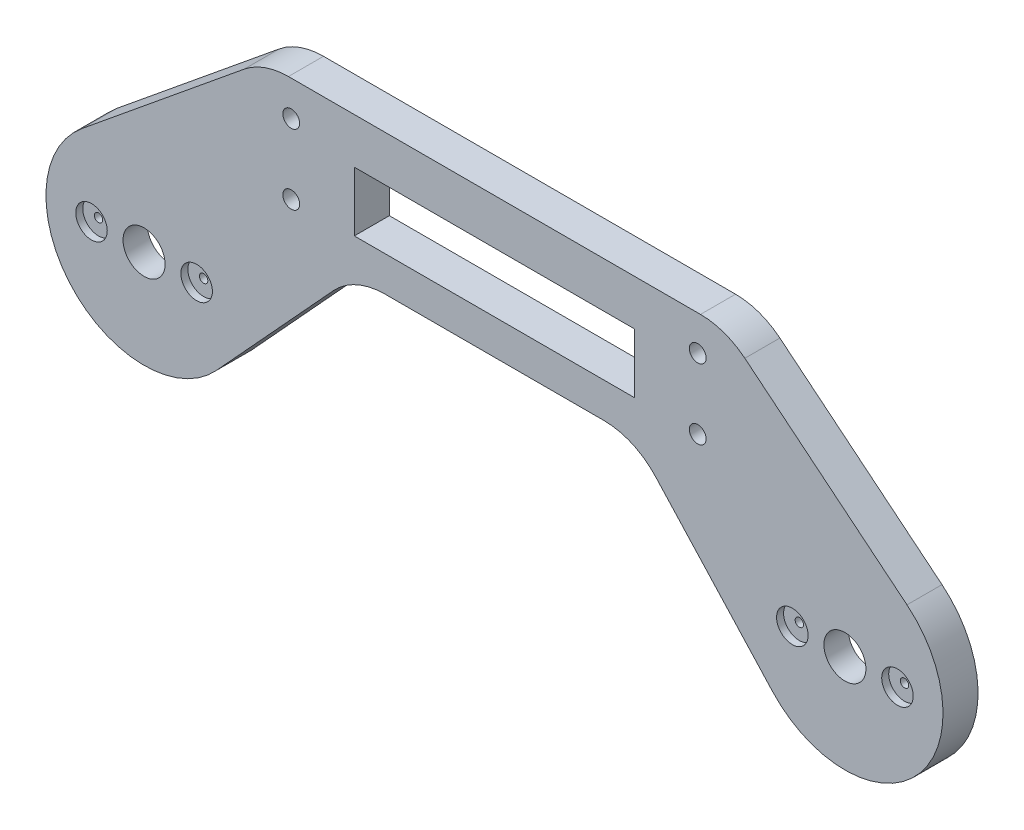
ISO-10303-21;
HEADER;
FILE_DESCRIPTION(('STEP AP214'),'2;1');
FILE_NAME('part.step','',(''),(''),'','','');
FILE_SCHEMA(('AUTOMOTIVE_DESIGN { 1 0 10303 214 1 1 1 1 }'));
ENDSEC;
DATA;
#1=APPLICATION_CONTEXT('core data for automotive mechanical design processes');
#2=APPLICATION_PROTOCOL_DEFINITION('international standard','automotive_design',2000,#1);
#3=PRODUCT_CONTEXT('',#1,'mechanical');
#4=PRODUCT('Part','Part','',(#3));
#5=PRODUCT_RELATED_PRODUCT_CATEGORY('part','',(#4));
#6=PRODUCT_DEFINITION_FORMATION('','',#4);
#7=PRODUCT_DEFINITION_CONTEXT('part definition',#1,'design');
#8=PRODUCT_DEFINITION('design','',#6,#7);
#9=PRODUCT_DEFINITION_SHAPE('','',#8);
#10=(LENGTH_UNIT() NAMED_UNIT(*) SI_UNIT(.MILLI.,.METRE.));
#11=(NAMED_UNIT(*) PLANE_ANGLE_UNIT() SI_UNIT($,.RADIAN.));
#12=(NAMED_UNIT(*) SI_UNIT($,.STERADIAN.) SOLID_ANGLE_UNIT());
#13=UNCERTAINTY_MEASURE_WITH_UNIT(LENGTH_MEASURE(1.E-05),#10,'distance_accuracy_value','');
#14=(GEOMETRIC_REPRESENTATION_CONTEXT(3) GLOBAL_UNCERTAINTY_ASSIGNED_CONTEXT((#13)) GLOBAL_UNIT_ASSIGNED_CONTEXT((#10,
#11,#12)) REPRESENTATION_CONTEXT('',''));
#15=CARTESIAN_POINT('',(0.,0.,0.));
#16=DIRECTION('',(0.,0.,1.));
#17=DIRECTION('',(1.,0.,0.));
#18=AXIS2_PLACEMENT_3D('',#15,#16,#17);
#19=CARTESIAN_POINT('',(42.5,-22.,6.5));
#20=DIRECTION('',(0.,0.,-1.));
#21=DIRECTION('',(-1.,0.,0.));
#22=AXIS2_PLACEMENT_3D('',#19,#20,#21);
#23=CYLINDRICAL_SURFACE('',#22,0.6);
#24=CARTESIAN_POINT('',(42.5,-22.,1.5));
#25=DIRECTION('',(0.,0.,-1.));
#26=DIRECTION('',(-1.,0.,0.));
#27=AXIS2_PLACEMENT_3D('',#24,#25,#26);
#28=CIRCLE('',#27,0.6);
#29=CARTESIAN_POINT('',(41.9,-22.,1.5));
#30=VERTEX_POINT('',#29);
#31=EDGE_CURVE('E347',#30,#30,#28,.T.);
#32=ORIENTED_EDGE('',*,*,#31,.T.);
#33=EDGE_LOOP('',(#32));
#34=FACE_BOUND('',#33,.T.);
#35=CARTESIAN_POINT('',(42.5,-22.,4.));
#36=DIRECTION('',(0.,0.,1.));
#37=DIRECTION('',(1.,0.,0.));
#38=AXIS2_PLACEMENT_3D('',#35,#36,#37);
#39=CIRCLE('',#38,0.6);
#40=CARTESIAN_POINT('',(43.1,-22.,4.));
#41=VERTEX_POINT('',#40);
#42=EDGE_CURVE('E40',#41,#41,#39,.F.);
#43=ORIENTED_EDGE('',*,*,#42,.F.);
#44=EDGE_LOOP('',(#43));
#45=FACE_BOUND('',#44,.T.);
#46=ADVANCED_FACE('F36',(#34,#45),#23,.F.);
#47=CARTESIAN_POINT('',(57.5,-22.,6.5));
#48=DIRECTION('',(0.,0.,-1.));
#49=DIRECTION('',(-1.,0.,0.));
#50=AXIS2_PLACEMENT_3D('',#47,#48,#49);
#51=CYLINDRICAL_SURFACE('',#50,0.6);
#52=CARTESIAN_POINT('',(57.5,-22.,1.5));
#53=DIRECTION('',(0.,0.,-1.));
#54=DIRECTION('',(-1.,0.,0.));
#55=AXIS2_PLACEMENT_3D('',#52,#53,#54);
#56=CIRCLE('',#55,0.6);
#57=CARTESIAN_POINT('',(56.9,-22.,1.5));
#58=VERTEX_POINT('',#57);
#59=EDGE_CURVE('E344',#58,#58,#56,.T.);
#60=ORIENTED_EDGE('',*,*,#59,.T.);
#61=EDGE_LOOP('',(#60));
#62=FACE_BOUND('',#61,.T.);
#63=CARTESIAN_POINT('',(57.5,-22.,4.));
#64=DIRECTION('',(0.,0.,1.));
#65=DIRECTION('',(1.,0.,0.));
#66=AXIS2_PLACEMENT_3D('',#63,#64,#65);
#67=CIRCLE('',#66,0.6);
#68=CARTESIAN_POINT('',(58.1,-22.,4.));
#69=VERTEX_POINT('',#68);
#70=EDGE_CURVE('E303',#69,#69,#67,.F.);
#71=ORIENTED_EDGE('',*,*,#70,.F.);
#72=EDGE_LOOP('',(#71));
#73=FACE_BOUND('',#72,.T.);
#74=ADVANCED_FACE('F446',(#62,#73),#51,.F.);
#75=CARTESIAN_POINT('',(-42.5,-22.,6.5));
#76=DIRECTION('',(0.,0.,-1.));
#77=DIRECTION('',(-1.,0.,0.));
#78=AXIS2_PLACEMENT_3D('',#75,#76,#77);
#79=CYLINDRICAL_SURFACE('',#78,0.6);
#80=CARTESIAN_POINT('',(-42.5,-22.,1.5));
#81=DIRECTION('',(0.,0.,1.));
#82=DIRECTION('',(1.,0.,0.));
#83=AXIS2_PLACEMENT_3D('',#80,#81,#82);
#84=CIRCLE('',#83,0.6);
#85=CARTESIAN_POINT('',(-41.9,-22.,1.5));
#86=VERTEX_POINT('',#85);
#87=EDGE_CURVE('E334',#86,#86,#84,.T.);
#88=ORIENTED_EDGE('',*,*,#87,.F.);
#89=EDGE_LOOP('',(#88));
#90=FACE_BOUND('',#89,.T.);
#91=CARTESIAN_POINT('',(-42.5,-22.,4.));
#92=DIRECTION('',(0.,0.,1.));
#93=DIRECTION('',(1.,0.,0.));
#94=AXIS2_PLACEMENT_3D('',#91,#92,#93);
#95=CIRCLE('',#94,0.6);
#96=CARTESIAN_POINT('',(-41.9,-22.,4.));
#97=VERTEX_POINT('',#96);
#98=EDGE_CURVE('E299',#97,#97,#95,.T.);
#99=ORIENTED_EDGE('',*,*,#98,.T.);
#100=EDGE_LOOP('',(#99));
#101=FACE_BOUND('',#100,.T.);
#102=ADVANCED_FACE('F452',(#90,#101),#79,.F.);
#103=CARTESIAN_POINT('',(-57.5,-22.,6.5));
#104=DIRECTION('',(0.,0.,-1.));
#105=DIRECTION('',(-1.,0.,0.));
#106=AXIS2_PLACEMENT_3D('',#103,#104,#105);
#107=CYLINDRICAL_SURFACE('',#106,0.6);
#108=CARTESIAN_POINT('',(-57.5,-22.,1.5));
#109=DIRECTION('',(0.,0.,1.));
#110=DIRECTION('',(1.,0.,0.));
#111=AXIS2_PLACEMENT_3D('',#108,#109,#110);
#112=CIRCLE('',#111,0.6);
#113=CARTESIAN_POINT('',(-56.9,-22.,1.5));
#114=VERTEX_POINT('',#113);
#115=EDGE_CURVE('E302',#114,#114,#112,.T.);
#116=ORIENTED_EDGE('',*,*,#115,.F.);
#117=EDGE_LOOP('',(#116));
#118=FACE_BOUND('',#117,.T.);
#119=CARTESIAN_POINT('',(-57.5,-22.,4.));
#120=DIRECTION('',(0.,0.,1.));
#121=DIRECTION('',(1.,0.,0.));
#122=AXIS2_PLACEMENT_3D('',#119,#120,#121);
#123=CIRCLE('',#122,0.6);
#124=CARTESIAN_POINT('',(-56.9,-22.,4.));
#125=VERTEX_POINT('',#124);
#126=EDGE_CURVE('E296',#125,#125,#123,.T.);
#127=ORIENTED_EDGE('',*,*,#126,.T.);
#128=EDGE_LOOP('',(#127));
#129=FACE_BOUND('',#128,.T.);
#130=ADVANCED_FACE('F645',(#118,#129),#107,.F.);
#131=CARTESIAN_POINT('',(15.6021977856104,-20.,5.));
#132=DIRECTION('',(0.,0.,-1.));
#133=DIRECTION('',(-1.,0.,0.));
#134=AXIS2_PLACEMENT_3D('',#131,#132,#133);
#135=CYLINDRICAL_SURFACE('',#134,10.);
#136=CARTESIAN_POINT('',(15.6021977856104,-20.,0.));
#137=DIRECTION('',(0.,0.,-1.));
#138=DIRECTION('',(-1.,0.,0.));
#139=AXIS2_PLACEMENT_3D('',#136,#137,#138);
#140=CIRCLE('',#139,10.);
#141=CARTESIAN_POINT('',(15.6021977856103,-10.,0.));
#142=VERTEX_POINT('',#141);
#143=CARTESIAN_POINT('',(22.9723632519462,-13.241253000827,0.));
#144=VERTEX_POINT('',#143);
#145=EDGE_CURVE('E188',#142,#144,#140,.T.);
#146=ORIENTED_EDGE('',*,*,#145,.T.);
#147=DIRECTION('',(0.,0.,-1.));
#148=VECTOR('',#147,1.);
#149=CARTESIAN_POINT('',(22.9723632519462,-13.241253000827,5.));
#150=LINE('',#149,#148);
#151=CARTESIAN_POINT('',(22.9723632519462,-13.241253000827,5.));
#152=VERTEX_POINT('',#151);
#153=EDGE_CURVE('E11',#152,#144,#150,.T.);
#154=ORIENTED_EDGE('',*,*,#153,.F.);
#155=CARTESIAN_POINT('',(15.6021977856104,-20.,5.));
#156=DIRECTION('',(0.,0.,-1.));
#157=DIRECTION('',(-1.,0.,0.));
#158=AXIS2_PLACEMENT_3D('',#155,#156,#157);
#159=CIRCLE('',#158,10.);
#160=CARTESIAN_POINT('',(15.6021977856103,-10.,5.));
#161=VERTEX_POINT('',#160);
#162=EDGE_CURVE('E192',#161,#152,#159,.T.);
#163=ORIENTED_EDGE('',*,*,#162,.F.);
#164=DIRECTION('',(0.,0.,-1.));
#165=VECTOR('',#164,1.);
#166=CARTESIAN_POINT('',(15.6021977856103,-10.,5.));
#167=LINE('',#166,#165);
#168=EDGE_CURVE('E218',#161,#142,#167,.T.);
#169=ORIENTED_EDGE('',*,*,#168,.T.);
#170=EDGE_LOOP('',(#146,#154,#163,#169));
#171=FACE_BOUND('',#170,.T.);
#172=ADVANCED_FACE('F38',(#171),#135,.F.);
#173=CARTESIAN_POINT('',(22.9723632519462,-13.241253000827,5.));
#174=DIRECTION('',(0.737016546633586,0.675874699917302,0.));
#175=DIRECTION('',(-0.675874699917302,0.737016546633586,0.));
#176=AXIS2_PLACEMENT_3D('',#173,#174,#175);
#177=PLANE('',#176);
#178=DIRECTION('',(0.675874699917302,-0.737016546633586,0.));
#179=VECTOR('',#178,1.);
#180=CARTESIAN_POINT('',(22.9723632519462,-13.241253000827,0.));
#181=LINE('',#180,#179);
#182=CARTESIAN_POINT('',(39.6817683471298,-31.4622457988422,0.));
#183=VERTEX_POINT('',#182);
#184=EDGE_CURVE('E221',#144,#183,#181,.T.);
#185=ORIENTED_EDGE('',*,*,#184,.T.);
#186=DIRECTION('',(0.,0.,-1.));
#187=VECTOR('',#186,1.);
#188=CARTESIAN_POINT('',(39.6817683471298,-31.4622457988422,5.));
#189=LINE('',#188,#187);
#190=CARTESIAN_POINT('',(39.6817683471298,-31.4622457988422,5.));
#191=VERTEX_POINT('',#190);
#192=EDGE_CURVE('E45',#191,#183,#189,.T.);
#193=ORIENTED_EDGE('',*,*,#192,.F.);
#194=DIRECTION('',(0.675874699917302,-0.737016546633586,0.));
#195=VECTOR('',#194,1.);
#196=CARTESIAN_POINT('',(22.9723632519462,-13.241253000827,5.));
#197=LINE('',#196,#195);
#198=EDGE_CURVE('E195',#152,#191,#197,.T.);
#199=ORIENTED_EDGE('',*,*,#198,.F.);
#200=ORIENTED_EDGE('',*,*,#153,.T.);
#201=EDGE_LOOP('',(#185,#193,#199,#200));
#202=FACE_BOUND('',#201,.T.);
#203=ADVANCED_FACE('F387',(#202),#177,.F.);
#204=CARTESIAN_POINT('',(50.,-22.,5.));
#205=DIRECTION('',(0.,0.,-1.));
#206=DIRECTION('',(-1.,0.,0.));
#207=AXIS2_PLACEMENT_3D('',#204,#205,#206);
#208=CYLINDRICAL_SURFACE('',#207,14.);
#209=CARTESIAN_POINT('',(50.,-22.,0.));
#210=DIRECTION('',(0.,0.,1.));
#211=DIRECTION('',(1.,0.,0.));
#212=AXIS2_PLACEMENT_3D('',#209,#210,#211);
#213=CIRCLE('',#212,14.);
#214=CARTESIAN_POINT('',(58.8580242214528,-11.1586252305275,0.));
#215=VERTEX_POINT('',#214);
#216=EDGE_CURVE('E223',#183,#215,#213,.T.);
#217=ORIENTED_EDGE('',*,*,#216,.T.);
#218=DIRECTION('',(0.,0.,-1.));
#219=VECTOR('',#218,1.);
#220=CARTESIAN_POINT('',(58.8580242214528,-11.1586252305275,5.));
#221=LINE('',#220,#219);
#222=CARTESIAN_POINT('',(58.8580242214528,-11.1586252305275,5.));
#223=VERTEX_POINT('',#222);
#224=EDGE_CURVE('E268',#223,#215,#221,.T.);
#225=ORIENTED_EDGE('',*,*,#224,.F.);
#226=CARTESIAN_POINT('',(50.,-22.,5.));
#227=DIRECTION('',(0.,0.,1.));
#228=DIRECTION('',(1.,0.,0.));
#229=AXIS2_PLACEMENT_3D('',#226,#227,#228);
#230=CIRCLE('',#229,14.);
#231=EDGE_CURVE('E198',#191,#223,#230,.T.);
#232=ORIENTED_EDGE('',*,*,#231,.F.);
#233=ORIENTED_EDGE('',*,*,#192,.T.);
#234=EDGE_LOOP('',(#217,#225,#232,#233));
#235=FACE_BOUND('',#234,.T.);
#236=ADVANCED_FACE('F392',(#235),#208,.T.);
#237=CARTESIAN_POINT('',(35.723215038412,7.74383912105182,5.));
#238=DIRECTION('',(-0.63271601581806,-0.774383912105178,0.));
#239=DIRECTION('',(0.774383912105178,-0.63271601581806,0.));
#240=AXIS2_PLACEMENT_3D('',#237,#238,#239);
#241=PLANE('',#240);
#242=DIRECTION('',(-0.774383912105178,0.63271601581806,0.));
#243=VECTOR('',#242,1.);
#244=CARTESIAN_POINT('',(35.723215038412,7.74383912105182,0.));
#245=LINE('',#244,#243);
#246=CARTESIAN_POINT('',(35.723215038412,7.74383912105181,0.));
#247=VERTEX_POINT('',#246);
#248=EDGE_CURVE('E225',#215,#247,#245,.T.);
#249=ORIENTED_EDGE('',*,*,#248,.T.);
#250=DIRECTION('',(0.,0.,-1.));
#251=VECTOR('',#250,1.);
#252=CARTESIAN_POINT('',(35.723215038412,7.74383912105181,5.));
#253=LINE('',#252,#251);
#254=CARTESIAN_POINT('',(35.723215038412,7.74383912105181,5.));
#255=VERTEX_POINT('',#254);
#256=EDGE_CURVE('E265',#255,#247,#253,.T.);
#257=ORIENTED_EDGE('',*,*,#256,.F.);
#258=DIRECTION('',(-0.774383912105178,0.63271601581806,0.));
#259=VECTOR('',#258,1.);
#260=CARTESIAN_POINT('',(35.723215038412,7.74383912105182,5.));
#261=LINE('',#260,#259);
#262=EDGE_CURVE('E200',#223,#255,#261,.T.);
#263=ORIENTED_EDGE('',*,*,#262,.F.);
#264=ORIENTED_EDGE('',*,*,#224,.T.);
#265=EDGE_LOOP('',(#249,#257,#263,#264));
#266=FACE_BOUND('',#265,.T.);
#267=ADVANCED_FACE('F398',(#266),#241,.F.);
#268=CARTESIAN_POINT('',(29.3960548802314,0.,5.));
#269=DIRECTION('',(0.,0.,-1.));
#270=DIRECTION('',(-1.,0.,0.));
#271=AXIS2_PLACEMENT_3D('',#268,#269,#270);
#272=CYLINDRICAL_SURFACE('',#271,10.);
#273=CARTESIAN_POINT('',(29.3960548802314,0.,0.));
#274=DIRECTION('',(0.,0.,1.));
#275=DIRECTION('',(1.,0.,0.));
#276=AXIS2_PLACEMENT_3D('',#273,#274,#275);
#277=CIRCLE('',#276,10.);
#278=CARTESIAN_POINT('',(29.3960548802314,10.,0.));
#279=VERTEX_POINT('',#278);
#280=EDGE_CURVE('E227',#247,#279,#277,.T.);
#281=ORIENTED_EDGE('',*,*,#280,.T.);
#282=DIRECTION('',(0.,0.,-1.));
#283=VECTOR('',#282,1.);
#284=CARTESIAN_POINT('',(29.3960548802314,10.,5.));
#285=LINE('',#284,#283);
#286=CARTESIAN_POINT('',(29.3960548802314,10.,5.));
#287=VERTEX_POINT('',#286);
#288=EDGE_CURVE('E262',#287,#279,#285,.T.);
#289=ORIENTED_EDGE('',*,*,#288,.F.);
#290=CARTESIAN_POINT('',(29.3960548802314,0.,5.));
#291=DIRECTION('',(0.,0.,1.));
#292=DIRECTION('',(1.,0.,0.));
#293=AXIS2_PLACEMENT_3D('',#290,#291,#292);
#294=CIRCLE('',#293,10.);
#295=EDGE_CURVE('E202',#255,#287,#294,.T.);
#296=ORIENTED_EDGE('',*,*,#295,.F.);
#297=ORIENTED_EDGE('',*,*,#256,.T.);
#298=EDGE_LOOP('',(#281,#289,#296,#297));
#299=FACE_BOUND('',#298,.T.);
#300=ADVANCED_FACE('F402',(#299),#272,.T.);
#301=CARTESIAN_POINT('',(-29.3960548802314,10.,5.));
#302=DIRECTION('',(0.,-1.,0.));
#303=DIRECTION('',(1.,0.,0.));
#304=AXIS2_PLACEMENT_3D('',#301,#302,#303);
#305=PLANE('',#304);
#306=DIRECTION('',(-1.,0.,0.));
#307=VECTOR('',#306,1.);
#308=CARTESIAN_POINT('',(-29.3960548802314,10.,0.));
#309=LINE('',#308,#307);
#310=CARTESIAN_POINT('',(-29.3960548802314,10.,0.));
#311=VERTEX_POINT('',#310);
#312=EDGE_CURVE('E229',#279,#311,#309,.T.);
#313=ORIENTED_EDGE('',*,*,#312,.T.);
#314=DIRECTION('',(0.,0.,-1.));
#315=VECTOR('',#314,1.);
#316=CARTESIAN_POINT('',(-29.3960548802314,10.,5.));
#317=LINE('',#316,#315);
#318=CARTESIAN_POINT('',(-29.3960548802314,10.,5.));
#319=VERTEX_POINT('',#318);
#320=EDGE_CURVE('E259',#319,#311,#317,.T.);
#321=ORIENTED_EDGE('',*,*,#320,.F.);
#322=DIRECTION('',(-1.,0.,0.));
#323=VECTOR('',#322,1.);
#324=CARTESIAN_POINT('',(-29.3960548802314,10.,5.));
#325=LINE('',#324,#323);
#326=EDGE_CURVE('E204',#287,#319,#325,.T.);
#327=ORIENTED_EDGE('',*,*,#326,.F.);
#328=ORIENTED_EDGE('',*,*,#288,.T.);
#329=EDGE_LOOP('',(#313,#321,#327,#328));
#330=FACE_BOUND('',#329,.T.);
#331=ADVANCED_FACE('F407',(#330),#305,.F.);
#332=CARTESIAN_POINT('',(-29.3960548802314,0.,5.));
#333=DIRECTION('',(0.,0.,-1.));
#334=DIRECTION('',(-1.,0.,0.));
#335=AXIS2_PLACEMENT_3D('',#332,#333,#334);
#336=CYLINDRICAL_SURFACE('',#335,10.);
#337=CARTESIAN_POINT('',(-29.3960548802314,0.,0.));
#338=DIRECTION('',(0.,0.,1.));
#339=DIRECTION('',(1.,0.,0.));
#340=AXIS2_PLACEMENT_3D('',#337,#338,#339);
#341=CIRCLE('',#340,10.);
#342=CARTESIAN_POINT('',(-35.723215038412,7.74383912105178,0.));
#343=VERTEX_POINT('',#342);
#344=EDGE_CURVE('E231',#311,#343,#341,.T.);
#345=ORIENTED_EDGE('',*,*,#344,.T.);
#346=DIRECTION('',(0.,0.,-1.));
#347=VECTOR('',#346,1.);
#348=CARTESIAN_POINT('',(-35.723215038412,7.74383912105178,5.));
#349=LINE('',#348,#347);
#350=CARTESIAN_POINT('',(-35.723215038412,7.74383912105178,5.));
#351=VERTEX_POINT('',#350);
#352=EDGE_CURVE('E256',#351,#343,#349,.T.);
#353=ORIENTED_EDGE('',*,*,#352,.F.);
#354=CARTESIAN_POINT('',(-29.3960548802314,0.,5.));
#355=DIRECTION('',(0.,0.,1.));
#356=DIRECTION('',(1.,0.,0.));
#357=AXIS2_PLACEMENT_3D('',#354,#355,#356);
#358=CIRCLE('',#357,10.);
#359=EDGE_CURVE('E206',#319,#351,#358,.T.);
#360=ORIENTED_EDGE('',*,*,#359,.F.);
#361=ORIENTED_EDGE('',*,*,#320,.T.);
#362=EDGE_LOOP('',(#345,#353,#360,#361));
#363=FACE_BOUND('',#362,.T.);
#364=ADVANCED_FACE('F413',(#363),#336,.T.);
#365=CARTESIAN_POINT('',(-35.723215038412,7.74383912105178,5.));
#366=DIRECTION('',(0.63271601581806,-0.774383912105179,0.));
#367=DIRECTION('',(0.774383912105179,0.63271601581806,0.));
#368=AXIS2_PLACEMENT_3D('',#365,#366,#367);
#369=PLANE('',#368);
#370=DIRECTION('',(-0.774383912105179,-0.63271601581806,0.));
#371=VECTOR('',#370,1.);
#372=CARTESIAN_POINT('',(-35.723215038412,7.74383912105178,0.));
#373=LINE('',#372,#371);
#374=CARTESIAN_POINT('',(-58.8580242214528,-11.1586252305275,0.));
#375=VERTEX_POINT('',#374);
#376=EDGE_CURVE('E233',#343,#375,#373,.T.);
#377=ORIENTED_EDGE('',*,*,#376,.T.);
#378=DIRECTION('',(0.,0.,-1.));
#379=VECTOR('',#378,1.);
#380=CARTESIAN_POINT('',(-58.8580242214528,-11.1586252305275,5.));
#381=LINE('',#380,#379);
#382=CARTESIAN_POINT('',(-58.8580242214528,-11.1586252305275,5.));
#383=VERTEX_POINT('',#382);
#384=EDGE_CURVE('E253',#383,#375,#381,.T.);
#385=ORIENTED_EDGE('',*,*,#384,.F.);
#386=DIRECTION('',(-0.774383912105179,-0.63271601581806,0.));
#387=VECTOR('',#386,1.);
#388=CARTESIAN_POINT('',(-35.723215038412,7.74383912105178,5.));
#389=LINE('',#388,#387);
#390=EDGE_CURVE('E208',#351,#383,#389,.T.);
#391=ORIENTED_EDGE('',*,*,#390,.F.);
#392=ORIENTED_EDGE('',*,*,#352,.T.);
#393=EDGE_LOOP('',(#377,#385,#391,#392));
#394=FACE_BOUND('',#393,.T.);
#395=ADVANCED_FACE('F417',(#394),#369,.F.);
#396=CARTESIAN_POINT('',(-50.,-22.,5.));
#397=DIRECTION('',(0.,0.,-1.));
#398=DIRECTION('',(-1.,0.,0.));
#399=AXIS2_PLACEMENT_3D('',#396,#397,#398);
#400=CYLINDRICAL_SURFACE('',#399,14.);
#401=CARTESIAN_POINT('',(-50.,-22.,0.));
#402=DIRECTION('',(0.,0.,1.));
#403=DIRECTION('',(1.,0.,0.));
#404=AXIS2_PLACEMENT_3D('',#401,#402,#403);
#405=CIRCLE('',#404,14.);
#406=CARTESIAN_POINT('',(-39.6817683471298,-31.4622457988422,0.));
#407=VERTEX_POINT('',#406);
#408=EDGE_CURVE('E235',#375,#407,#405,.T.);
#409=ORIENTED_EDGE('',*,*,#408,.T.);
#410=DIRECTION('',(0.,0.,-1.));
#411=VECTOR('',#410,1.);
#412=CARTESIAN_POINT('',(-39.6817683471298,-31.4622457988422,5.));
#413=LINE('',#412,#411);
#414=CARTESIAN_POINT('',(-39.6817683471298,-31.4622457988422,5.));
#415=VERTEX_POINT('',#414);
#416=EDGE_CURVE('E250',#415,#407,#413,.T.);
#417=ORIENTED_EDGE('',*,*,#416,.F.);
#418=CARTESIAN_POINT('',(-50.,-22.,5.));
#419=DIRECTION('',(0.,0.,1.));
#420=DIRECTION('',(1.,0.,0.));
#421=AXIS2_PLACEMENT_3D('',#418,#419,#420);
#422=CIRCLE('',#421,14.);
#423=EDGE_CURVE('E210',#383,#415,#422,.T.);
#424=ORIENTED_EDGE('',*,*,#423,.F.);
#425=ORIENTED_EDGE('',*,*,#384,.T.);
#426=EDGE_LOOP('',(#409,#417,#424,#425));
#427=FACE_BOUND('',#426,.T.);
#428=ADVANCED_FACE('F422',(#427),#400,.T.);
#429=CARTESIAN_POINT('',(-22.9723632519463,-13.241253000827,5.));
#430=DIRECTION('',(-0.737016546633587,0.675874699917301,0.));
#431=DIRECTION('',(-0.675874699917301,-0.737016546633587,0.));
#432=AXIS2_PLACEMENT_3D('',#429,#430,#431);
#433=PLANE('',#432);
#434=DIRECTION('',(0.675874699917301,0.737016546633587,0.));
#435=VECTOR('',#434,1.);
#436=CARTESIAN_POINT('',(-22.9723632519463,-13.241253000827,0.));
#437=LINE('',#436,#435);
#438=CARTESIAN_POINT('',(-22.9723632519463,-13.241253000827,0.));
#439=VERTEX_POINT('',#438);
#440=EDGE_CURVE('E237',#407,#439,#437,.T.);
#441=ORIENTED_EDGE('',*,*,#440,.T.);
#442=DIRECTION('',(0.,0.,-1.));
#443=VECTOR('',#442,1.);
#444=CARTESIAN_POINT('',(-22.9723632519463,-13.241253000827,5.));
#445=LINE('',#444,#443);
#446=CARTESIAN_POINT('',(-22.9723632519463,-13.241253000827,5.));
#447=VERTEX_POINT('',#446);
#448=EDGE_CURVE('E247',#447,#439,#445,.T.);
#449=ORIENTED_EDGE('',*,*,#448,.F.);
#450=DIRECTION('',(0.675874699917301,0.737016546633587,0.));
#451=VECTOR('',#450,1.);
#452=CARTESIAN_POINT('',(-22.9723632519463,-13.241253000827,5.));
#453=LINE('',#452,#451);
#454=EDGE_CURVE('E212',#415,#447,#453,.T.);
#455=ORIENTED_EDGE('',*,*,#454,.F.);
#456=ORIENTED_EDGE('',*,*,#416,.T.);
#457=EDGE_LOOP('',(#441,#449,#455,#456));
#458=FACE_BOUND('',#457,.T.);
#459=ADVANCED_FACE('F428',(#458),#433,.F.);
#460=CARTESIAN_POINT('',(-15.6021977856104,-20.,5.));
#461=DIRECTION('',(0.,0.,-1.));
#462=DIRECTION('',(-1.,0.,0.));
#463=AXIS2_PLACEMENT_3D('',#460,#461,#462);
#464=CYLINDRICAL_SURFACE('',#463,10.);
#465=CARTESIAN_POINT('',(-15.6021977856104,-20.,0.));
#466=DIRECTION('',(0.,0.,-1.));
#467=DIRECTION('',(1.,0.,0.));
#468=AXIS2_PLACEMENT_3D('',#465,#466,#467);
#469=CIRCLE('',#468,10.);
#470=CARTESIAN_POINT('',(-15.6021977856103,-10.,0.));
#471=VERTEX_POINT('',#470);
#472=EDGE_CURVE('E239',#439,#471,#469,.T.);
#473=ORIENTED_EDGE('',*,*,#472,.T.);
#474=DIRECTION('',(0.,0.,-1.));
#475=VECTOR('',#474,1.);
#476=CARTESIAN_POINT('',(-15.6021977856103,-10.,5.));
#477=LINE('',#476,#475);
#478=CARTESIAN_POINT('',(-15.6021977856103,-10.,5.));
#479=VERTEX_POINT('',#478);
#480=EDGE_CURVE('E244',#479,#471,#477,.T.);
#481=ORIENTED_EDGE('',*,*,#480,.F.);
#482=CARTESIAN_POINT('',(-15.6021977856104,-20.,5.));
#483=DIRECTION('',(0.,0.,-1.));
#484=DIRECTION('',(1.,0.,0.));
#485=AXIS2_PLACEMENT_3D('',#482,#483,#484);
#486=CIRCLE('',#485,10.);
#487=EDGE_CURVE('E214',#447,#479,#486,.T.);
#488=ORIENTED_EDGE('',*,*,#487,.F.);
#489=ORIENTED_EDGE('',*,*,#448,.T.);
#490=EDGE_LOOP('',(#473,#481,#488,#489));
#491=FACE_BOUND('',#490,.T.);
#492=ADVANCED_FACE('F432',(#491),#464,.F.);
#493=CARTESIAN_POINT('',(-15.6021977856103,-10.,5.));
#494=DIRECTION('',(0.,1.,0.));
#495=DIRECTION('',(0.,0.,1.));
#496=AXIS2_PLACEMENT_3D('',#493,#494,#495);
#497=PLANE('',#496);
#498=DIRECTION('',(1.,0.,0.));
#499=VECTOR('',#498,1.);
#500=CARTESIAN_POINT('',(-15.6021977856103,-10.,0.));
#501=LINE('',#500,#499);
#502=EDGE_CURVE('E196',#471,#142,#501,.T.);
#503=ORIENTED_EDGE('',*,*,#502,.T.);
#504=ORIENTED_EDGE('',*,*,#168,.F.);
#505=DIRECTION('',(1.,0.,0.));
#506=VECTOR('',#505,1.);
#507=CARTESIAN_POINT('',(-15.6021977856103,-10.,5.));
#508=LINE('',#507,#506);
#509=EDGE_CURVE('E216',#479,#161,#508,.T.);
#510=ORIENTED_EDGE('',*,*,#509,.F.);
#511=ORIENTED_EDGE('',*,*,#480,.T.);
#512=EDGE_LOOP('',(#503,#504,#510,#511));
#513=FACE_BOUND('',#512,.T.);
#514=ADVANCED_FACE('F374',(#513),#497,.F.);
#515=CARTESIAN_POINT('',(15.6021977856104,-20.,5.));
#516=DIRECTION('',(0.,0.,-1.));
#517=DIRECTION('',(-1.,0.,0.));
#518=AXIS2_PLACEMENT_3D('',#515,#516,#517);
#519=PLANE('',#518);
#520=CARTESIAN_POINT('',(57.5,-22.,5.));
#521=DIRECTION('',(0.,0.,-1.));
#522=DIRECTION('',(-1.,0.,0.));
#523=AXIS2_PLACEMENT_3D('',#520,#521,#522);
#524=CIRCLE('',#523,2.25);
#525=CARTESIAN_POINT('',(55.25,-22.,5.));
#526=VERTEX_POINT('',#525);
#527=EDGE_CURVE('E311',#526,#526,#524,.T.);
#528=ORIENTED_EDGE('',*,*,#527,.T.);
#529=EDGE_LOOP('',(#528));
#530=FACE_BOUND('',#529,.T.);
#531=CARTESIAN_POINT('',(42.5,-22.,5.));
#532=DIRECTION('',(0.,0.,-1.));
#533=DIRECTION('',(-1.,0.,0.));
#534=AXIS2_PLACEMENT_3D('',#531,#532,#533);
#535=CIRCLE('',#534,2.25);
#536=CARTESIAN_POINT('',(40.25,-22.,5.));
#537=VERTEX_POINT('',#536);
#538=EDGE_CURVE('E321',#537,#537,#535,.T.);
#539=ORIENTED_EDGE('',*,*,#538,.T.);
#540=EDGE_LOOP('',(#539));
#541=FACE_BOUND('',#540,.T.);
#542=CARTESIAN_POINT('',(-57.5,-22.,5.));
#543=DIRECTION('',(0.,0.,1.));
#544=DIRECTION('',(1.,0.,0.));
#545=AXIS2_PLACEMENT_3D('',#542,#543,#544);
#546=CIRCLE('',#545,2.25);
#547=CARTESIAN_POINT('',(-55.25,-22.,5.));
#548=VERTEX_POINT('',#547);
#549=EDGE_CURVE('E326',#548,#548,#546,.T.);
#550=ORIENTED_EDGE('',*,*,#549,.F.);
#551=EDGE_LOOP('',(#550));
#552=FACE_BOUND('',#551,.T.);
#553=CARTESIAN_POINT('',(-42.5,-22.,5.));
#554=DIRECTION('',(0.,0.,1.));
#555=DIRECTION('',(1.,0.,0.));
#556=AXIS2_PLACEMENT_3D('',#553,#554,#555);
#557=CIRCLE('',#556,2.25);
#558=CARTESIAN_POINT('',(-40.25,-22.,5.));
#559=VERTEX_POINT('',#558);
#560=EDGE_CURVE('E309',#559,#559,#557,.T.);
#561=ORIENTED_EDGE('',*,*,#560,.F.);
#562=EDGE_LOOP('',(#561));
#563=FACE_BOUND('',#562,.T.);
#564=CARTESIAN_POINT('',(-50.,-22.,5.));
#565=DIRECTION('',(0.,0.,-1.));
#566=DIRECTION('',(-1.,0.,0.));
#567=AXIS2_PLACEMENT_3D('',#564,#565,#566);
#568=CIRCLE('',#567,3.);
#569=CARTESIAN_POINT('',(-53.,-22.,5.));
#570=VERTEX_POINT('',#569);
#571=EDGE_CURVE('E291',#570,#570,#568,.F.);
#572=ORIENTED_EDGE('',*,*,#571,.F.);
#573=EDGE_LOOP('',(#572));
#574=FACE_BOUND('',#573,.T.);
#575=CARTESIAN_POINT('',(50.,-22.,5.));
#576=DIRECTION('',(0.,0.,-1.));
#577=DIRECTION('',(-1.,0.,0.));
#578=AXIS2_PLACEMENT_3D('',#575,#576,#577);
#579=CIRCLE('',#578,3.);
#580=CARTESIAN_POINT('',(47.,-22.,5.));
#581=VERTEX_POINT('',#580);
#582=EDGE_CURVE('E286',#581,#581,#579,.T.);
#583=ORIENTED_EDGE('',*,*,#582,.T.);
#584=EDGE_LOOP('',(#583));
#585=FACE_BOUND('',#584,.T.);
#586=CARTESIAN_POINT('',(29.,-5.00000000000002,5.));
#587=DIRECTION('',(0.,0.,-1.));
#588=DIRECTION('',(-1.,0.,0.));
#589=AXIS2_PLACEMENT_3D('',#586,#587,#588);
#590=CIRCLE('',#589,1.2);
#591=CARTESIAN_POINT('',(27.8,-5.00000000000002,5.));
#592=VERTEX_POINT('',#591);
#593=EDGE_CURVE('E283',#592,#592,#590,.T.);
#594=ORIENTED_EDGE('',*,*,#593,.T.);
#595=EDGE_LOOP('',(#594));
#596=FACE_BOUND('',#595,.T.);
#597=CARTESIAN_POINT('',(29.,4.99999999999998,5.));
#598=DIRECTION('',(0.,0.,-1.));
#599=DIRECTION('',(-1.,0.,0.));
#600=AXIS2_PLACEMENT_3D('',#597,#598,#599);
#601=CIRCLE('',#600,1.2);
#602=CARTESIAN_POINT('',(27.8,4.99999999999998,5.));
#603=VERTEX_POINT('',#602);
#604=EDGE_CURVE('E357',#603,#603,#601,.T.);
#605=ORIENTED_EDGE('',*,*,#604,.T.);
#606=EDGE_LOOP('',(#605));
#607=FACE_BOUND('',#606,.T.);
#608=CARTESIAN_POINT('',(-29.,-5.00000000000002,5.));
#609=DIRECTION('',(0.,0.,1.));
#610=DIRECTION('',(1.,0.,0.));
#611=AXIS2_PLACEMENT_3D('',#608,#609,#610);
#612=CIRCLE('',#611,1.2);
#613=CARTESIAN_POINT('',(-27.8,-5.00000000000002,5.));
#614=VERTEX_POINT('',#613);
#615=EDGE_CURVE('E276',#614,#614,#612,.T.);
#616=ORIENTED_EDGE('',*,*,#615,.F.);
#617=EDGE_LOOP('',(#616));
#618=FACE_BOUND('',#617,.T.);
#619=CARTESIAN_POINT('',(-29.,4.99999999999998,5.));
#620=DIRECTION('',(0.,0.,1.));
#621=DIRECTION('',(1.,0.,0.));
#622=AXIS2_PLACEMENT_3D('',#619,#620,#621);
#623=CIRCLE('',#622,1.2);
#624=CARTESIAN_POINT('',(-27.8,4.99999999999998,5.));
#625=VERTEX_POINT('',#624);
#626=EDGE_CURVE('E175',#625,#625,#623,.T.);
#627=ORIENTED_EDGE('',*,*,#626,.F.);
#628=EDGE_LOOP('',(#627));
#629=FACE_BOUND('',#628,.T.);
#630=DIRECTION('',(1.,0.,0.));
#631=VECTOR('',#630,1.);
#632=CARTESIAN_POINT('',(-20.,-5.00000000000002,5.));
#633=LINE('',#632,#631);
#634=CARTESIAN_POINT('',(-20.,-5.00000000000001,5.));
#635=VERTEX_POINT('',#634);
#636=CARTESIAN_POINT('',(20.,-5.00000000000001,5.));
#637=VERTEX_POINT('',#636);
#638=EDGE_CURVE('E181',#635,#637,#633,.T.);
#639=ORIENTED_EDGE('',*,*,#638,.F.);
#640=DIRECTION('',(0.,-1.,0.));
#641=VECTOR('',#640,1.);
#642=CARTESIAN_POINT('',(-20.,-5.00000000000002,5.));
#643=LINE('',#642,#641);
#644=CARTESIAN_POINT('',(-20.,3.49999999999998,5.));
#645=VERTEX_POINT('',#644);
#646=EDGE_CURVE('E53',#645,#635,#643,.T.);
#647=ORIENTED_EDGE('',*,*,#646,.F.);
#648=DIRECTION('',(-1.,0.,0.));
#649=VECTOR('',#648,1.);
#650=CARTESIAN_POINT('',(-20.,3.49999999999998,5.));
#651=LINE('',#650,#649);
#652=CARTESIAN_POINT('',(20.,3.49999999999999,5.));
#653=VERTEX_POINT('',#652);
#654=EDGE_CURVE('E169',#653,#645,#651,.T.);
#655=ORIENTED_EDGE('',*,*,#654,.F.);
#656=DIRECTION('',(0.,1.,0.));
#657=VECTOR('',#656,1.);
#658=CARTESIAN_POINT('',(20.,-5.00000000000001,5.));
#659=LINE('',#658,#657);
#660=EDGE_CURVE('E172',#637,#653,#659,.T.);
#661=ORIENTED_EDGE('',*,*,#660,.F.);
#662=EDGE_LOOP('',(#639,#647,#655,#661));
#663=FACE_BOUND('',#662,.T.);
#664=ORIENTED_EDGE('',*,*,#162,.T.);
#665=ORIENTED_EDGE('',*,*,#198,.T.);
#666=ORIENTED_EDGE('',*,*,#231,.T.);
#667=ORIENTED_EDGE('',*,*,#262,.T.);
#668=ORIENTED_EDGE('',*,*,#295,.T.);
#669=ORIENTED_EDGE('',*,*,#326,.T.);
#670=ORIENTED_EDGE('',*,*,#359,.T.);
#671=ORIENTED_EDGE('',*,*,#390,.T.);
#672=ORIENTED_EDGE('',*,*,#423,.T.);
#673=ORIENTED_EDGE('',*,*,#454,.T.);
#674=ORIENTED_EDGE('',*,*,#487,.T.);
#675=ORIENTED_EDGE('',*,*,#509,.T.);
#676=EDGE_LOOP('',(#664,#665,#666,#667,#668,#669,#670,#671,#672,#673,#674,#675));
#677=FACE_BOUND('',#676,.T.);
#678=ADVANCED_FACE('F371',(#530,#541,#552,#563,#574,#585,#596,#607,#618,#629,#663,#677),#519,.F.);
#679=CARTESIAN_POINT('',(15.6021977856104,-20.,0.));
#680=DIRECTION('',(0.,0.,-1.));
#681=DIRECTION('',(-1.,0.,0.));
#682=AXIS2_PLACEMENT_3D('',#679,#680,#681);
#683=PLANE('',#682);
#684=CARTESIAN_POINT('',(-50.,-22.,0.));
#685=DIRECTION('',(0.,0.,1.));
#686=DIRECTION('',(1.,0.,0.));
#687=AXIS2_PLACEMENT_3D('',#684,#685,#686);
#688=CIRCLE('',#687,9.);
#689=CARTESIAN_POINT('',(-41.,-22.,0.));
#690=VERTEX_POINT('',#689);
#691=EDGE_CURVE('E294',#690,#690,#688,.T.);
#692=ORIENTED_EDGE('',*,*,#691,.T.);
#693=EDGE_LOOP('',(#692));
#694=FACE_BOUND('',#693,.T.);
#695=CARTESIAN_POINT('',(50.,-22.,0.));
#696=DIRECTION('',(0.,0.,-1.));
#697=DIRECTION('',(-1.,0.,0.));
#698=AXIS2_PLACEMENT_3D('',#695,#696,#697);
#699=CIRCLE('',#698,9.);
#700=CARTESIAN_POINT('',(41.,-22.,0.));
#701=VERTEX_POINT('',#700);
#702=EDGE_CURVE('E289',#701,#701,#699,.T.);
#703=ORIENTED_EDGE('',*,*,#702,.F.);
#704=EDGE_LOOP('',(#703));
#705=FACE_BOUND('',#704,.T.);
#706=CARTESIAN_POINT('',(29.,-5.00000000000002,0.));
#707=DIRECTION('',(0.,0.,-1.));
#708=DIRECTION('',(-1.,0.,0.));
#709=AXIS2_PLACEMENT_3D('',#706,#707,#708);
#710=CIRCLE('',#709,1.2);
#711=CARTESIAN_POINT('',(27.8,-5.00000000000002,0.));
#712=VERTEX_POINT('',#711);
#713=EDGE_CURVE('E282',#712,#712,#710,.F.);
#714=ORIENTED_EDGE('',*,*,#713,.T.);
#715=EDGE_LOOP('',(#714));
#716=FACE_BOUND('',#715,.T.);
#717=CARTESIAN_POINT('',(29.,4.99999999999998,0.));
#718=DIRECTION('',(0.,0.,-1.));
#719=DIRECTION('',(-1.,0.,0.));
#720=AXIS2_PLACEMENT_3D('',#717,#718,#719);
#721=CIRCLE('',#720,1.2);
#722=CARTESIAN_POINT('',(27.8,4.99999999999998,0.));
#723=VERTEX_POINT('',#722);
#724=EDGE_CURVE('E279',#723,#723,#721,.F.);
#725=ORIENTED_EDGE('',*,*,#724,.T.);
#726=EDGE_LOOP('',(#725));
#727=FACE_BOUND('',#726,.T.);
#728=CARTESIAN_POINT('',(-29.,-5.00000000000002,0.));
#729=DIRECTION('',(0.,0.,-1.));
#730=DIRECTION('',(-1.,0.,0.));
#731=AXIS2_PLACEMENT_3D('',#728,#729,#730);
#732=CIRCLE('',#731,1.2);
#733=CARTESIAN_POINT('',(-30.2,-5.00000000000002,0.));
#734=VERTEX_POINT('',#733);
#735=EDGE_CURVE('E182',#734,#734,#732,.T.);
#736=ORIENTED_EDGE('',*,*,#735,.F.);
#737=EDGE_LOOP('',(#736));
#738=FACE_BOUND('',#737,.T.);
#739=CARTESIAN_POINT('',(-29.,4.99999999999998,0.));
#740=DIRECTION('',(0.,0.,-1.));
#741=DIRECTION('',(-1.,0.,0.));
#742=AXIS2_PLACEMENT_3D('',#739,#740,#741);
#743=CIRCLE('',#742,1.2);
#744=CARTESIAN_POINT('',(-30.2,4.99999999999998,0.));
#745=VERTEX_POINT('',#744);
#746=EDGE_CURVE('E273',#745,#745,#743,.T.);
#747=ORIENTED_EDGE('',*,*,#746,.F.);
#748=EDGE_LOOP('',(#747));
#749=FACE_BOUND('',#748,.T.);
#750=DIRECTION('',(0.,-1.,0.));
#751=VECTOR('',#750,1.);
#752=CARTESIAN_POINT('',(-20.,-5.00000000000002,0.));
#753=LINE('',#752,#751);
#754=CARTESIAN_POINT('',(-20.,3.49999999999998,0.));
#755=VERTEX_POINT('',#754);
#756=CARTESIAN_POINT('',(-20.,-5.00000000000002,0.));
#757=VERTEX_POINT('',#756);
#758=EDGE_CURVE('E153',#755,#757,#753,.T.);
#759=ORIENTED_EDGE('',*,*,#758,.T.);
#760=DIRECTION('',(1.,0.,0.));
#761=VECTOR('',#760,1.);
#762=CARTESIAN_POINT('',(-20.,-5.00000000000002,0.));
#763=LINE('',#762,#761);
#764=CARTESIAN_POINT('',(20.,-5.00000000000001,0.));
#765=VERTEX_POINT('',#764);
#766=EDGE_CURVE('E162',#757,#765,#763,.T.);
#767=ORIENTED_EDGE('',*,*,#766,.T.);
#768=DIRECTION('',(0.,1.,0.));
#769=VECTOR('',#768,1.);
#770=CARTESIAN_POINT('',(20.,-5.00000000000001,0.));
#771=LINE('',#770,#769);
#772=CARTESIAN_POINT('',(20.,3.49999999999999,0.));
#773=VERTEX_POINT('',#772);
#774=EDGE_CURVE('E61',#765,#773,#771,.T.);
#775=ORIENTED_EDGE('',*,*,#774,.T.);
#776=DIRECTION('',(-1.,0.,0.));
#777=VECTOR('',#776,1.);
#778=CARTESIAN_POINT('',(-20.,3.49999999999998,0.));
#779=LINE('',#778,#777);
#780=EDGE_CURVE('E159',#773,#755,#779,.T.);
#781=ORIENTED_EDGE('',*,*,#780,.T.);
#782=EDGE_LOOP('',(#759,#767,#775,#781));
#783=FACE_BOUND('',#782,.T.);
#784=ORIENTED_EDGE('',*,*,#145,.F.);
#785=ORIENTED_EDGE('',*,*,#502,.F.);
#786=ORIENTED_EDGE('',*,*,#472,.F.);
#787=ORIENTED_EDGE('',*,*,#440,.F.);
#788=ORIENTED_EDGE('',*,*,#408,.F.);
#789=ORIENTED_EDGE('',*,*,#376,.F.);
#790=ORIENTED_EDGE('',*,*,#344,.F.);
#791=ORIENTED_EDGE('',*,*,#312,.F.);
#792=ORIENTED_EDGE('',*,*,#280,.F.);
#793=ORIENTED_EDGE('',*,*,#248,.F.);
#794=ORIENTED_EDGE('',*,*,#216,.F.);
#795=ORIENTED_EDGE('',*,*,#184,.F.);
#796=EDGE_LOOP('',(#784,#785,#786,#787,#788,#789,#790,#791,#792,#793,#794,#795));
#797=FACE_BOUND('',#796,.T.);
#798=ADVANCED_FACE('F166',(#694,#705,#716,#727,#738,#749,#783,#797),#683,.T.);
#799=CARTESIAN_POINT('',(-20.,-5.00000000000002,0.));
#800=DIRECTION('',(-1.,0.,0.));
#801=DIRECTION('',(0.,0.,1.));
#802=AXIS2_PLACEMENT_3D('',#799,#800,#801);
#803=PLANE('',#802);
#804=ORIENTED_EDGE('',*,*,#646,.T.);
#805=DIRECTION('',(0.,0.,1.));
#806=VECTOR('',#805,1.);
#807=CARTESIAN_POINT('',(-20.,-5.00000000000002,0.));
#808=LINE('',#807,#806);
#809=EDGE_CURVE('E149',#757,#635,#808,.T.);
#810=ORIENTED_EDGE('',*,*,#809,.F.);
#811=ORIENTED_EDGE('',*,*,#758,.F.);
#812=DIRECTION('',(0.,0.,1.));
#813=VECTOR('',#812,1.);
#814=CARTESIAN_POINT('',(-20.,3.49999999999998,0.));
#815=LINE('',#814,#813);
#816=EDGE_CURVE('E186',#755,#645,#815,.T.);
#817=ORIENTED_EDGE('',*,*,#816,.T.);
#818=EDGE_LOOP('',(#804,#810,#811,#817));
#819=FACE_BOUND('',#818,.T.);
#820=ADVANCED_FACE('F151',(#819),#803,.F.);
#821=CARTESIAN_POINT('',(-20.,3.49999999999998,0.));
#822=DIRECTION('',(0.,1.,0.));
#823=DIRECTION('',(-1.,0.,0.));
#824=AXIS2_PLACEMENT_3D('',#821,#822,#823);
#825=PLANE('',#824);
#826=ORIENTED_EDGE('',*,*,#654,.T.);
#827=ORIENTED_EDGE('',*,*,#816,.F.);
#828=ORIENTED_EDGE('',*,*,#780,.F.);
#829=DIRECTION('',(0.,0.,1.));
#830=VECTOR('',#829,1.);
#831=CARTESIAN_POINT('',(20.,3.49999999999999,0.));
#832=LINE('',#831,#830);
#833=EDGE_CURVE('E189',#773,#653,#832,.T.);
#834=ORIENTED_EDGE('',*,*,#833,.T.);
#835=EDGE_LOOP('',(#826,#827,#828,#834));
#836=FACE_BOUND('',#835,.T.);
#837=ADVANCED_FACE('F441',(#836),#825,.F.);
#838=CARTESIAN_POINT('',(20.,-5.00000000000001,0.));
#839=DIRECTION('',(1.,0.,0.));
#840=DIRECTION('',(0.,0.,-1.));
#841=AXIS2_PLACEMENT_3D('',#838,#839,#840);
#842=PLANE('',#841);
#843=ORIENTED_EDGE('',*,*,#660,.T.);
#844=ORIENTED_EDGE('',*,*,#833,.F.);
#845=ORIENTED_EDGE('',*,*,#774,.F.);
#846=DIRECTION('',(0.,0.,1.));
#847=VECTOR('',#846,1.);
#848=CARTESIAN_POINT('',(20.,-5.00000000000001,0.));
#849=LINE('',#848,#847);
#850=EDGE_CURVE('E158',#765,#637,#849,.T.);
#851=ORIENTED_EDGE('',*,*,#850,.T.);
#852=EDGE_LOOP('',(#843,#844,#845,#851));
#853=FACE_BOUND('',#852,.T.);
#854=ADVANCED_FACE('F489',(#853),#842,.F.);
#855=CARTESIAN_POINT('',(-20.,-5.00000000000002,0.));
#856=DIRECTION('',(0.,-1.,0.));
#857=DIRECTION('',(1.,0.,0.));
#858=AXIS2_PLACEMENT_3D('',#855,#856,#857);
#859=PLANE('',#858);
#860=ORIENTED_EDGE('',*,*,#638,.T.);
#861=ORIENTED_EDGE('',*,*,#850,.F.);
#862=ORIENTED_EDGE('',*,*,#766,.F.);
#863=ORIENTED_EDGE('',*,*,#809,.T.);
#864=EDGE_LOOP('',(#860,#861,#862,#863));
#865=FACE_BOUND('',#864,.T.);
#866=ADVANCED_FACE('F163',(#865),#859,.F.);
#867=CARTESIAN_POINT('',(-29.,4.99999999999998,-2.));
#868=DIRECTION('',(0.,0.,1.));
#869=DIRECTION('',(1.,0.,0.));
#870=AXIS2_PLACEMENT_3D('',#867,#868,#869);
#871=CYLINDRICAL_SURFACE('',#870,1.2);
#872=ORIENTED_EDGE('',*,*,#746,.T.);
#873=EDGE_LOOP('',(#872));
#874=FACE_BOUND('',#873,.T.);
#875=ORIENTED_EDGE('',*,*,#626,.T.);
#876=EDGE_LOOP('',(#875));
#877=FACE_BOUND('',#876,.T.);
#878=ADVANCED_FACE('F369',(#874,#877),#871,.F.);
#879=CARTESIAN_POINT('',(-29.,-5.00000000000002,-2.));
#880=DIRECTION('',(0.,0.,1.));
#881=DIRECTION('',(1.,0.,0.));
#882=AXIS2_PLACEMENT_3D('',#879,#880,#881);
#883=CYLINDRICAL_SURFACE('',#882,1.2);
#884=ORIENTED_EDGE('',*,*,#735,.T.);
#885=EDGE_LOOP('',(#884));
#886=FACE_BOUND('',#885,.T.);
#887=ORIENTED_EDGE('',*,*,#615,.T.);
#888=EDGE_LOOP('',(#887));
#889=FACE_BOUND('',#888,.T.);
#890=ADVANCED_FACE('F479',(#886,#889),#883,.F.);
#891=CARTESIAN_POINT('',(29.,4.99999999999998,-2.));
#892=DIRECTION('',(0.,0.,1.));
#893=DIRECTION('',(1.,0.,0.));
#894=AXIS2_PLACEMENT_3D('',#891,#892,#893);
#895=CYLINDRICAL_SURFACE('',#894,1.2);
#896=ORIENTED_EDGE('',*,*,#724,.F.);
#897=EDGE_LOOP('',(#896));
#898=FACE_BOUND('',#897,.T.);
#899=ORIENTED_EDGE('',*,*,#604,.F.);
#900=EDGE_LOOP('',(#899));
#901=FACE_BOUND('',#900,.T.);
#902=ADVANCED_FACE('F475',(#898,#901),#895,.F.);
#903=CARTESIAN_POINT('',(29.,-5.00000000000002,-2.));
#904=DIRECTION('',(0.,0.,1.));
#905=DIRECTION('',(1.,0.,0.));
#906=AXIS2_PLACEMENT_3D('',#903,#904,#905);
#907=CYLINDRICAL_SURFACE('',#906,1.2);
#908=ORIENTED_EDGE('',*,*,#713,.F.);
#909=EDGE_LOOP('',(#908));
#910=FACE_BOUND('',#909,.T.);
#911=ORIENTED_EDGE('',*,*,#593,.F.);
#912=EDGE_LOOP('',(#911));
#913=FACE_BOUND('',#912,.T.);
#914=ADVANCED_FACE('F471',(#910,#913),#907,.F.);
#915=CARTESIAN_POINT('',(50.,-22.,1.5));
#916=DIRECTION('',(0.,0.,-1.));
#917=DIRECTION('',(-1.,0.,0.));
#918=AXIS2_PLACEMENT_3D('',#915,#916,#917);
#919=CYLINDRICAL_SURFACE('',#918,9.);
#920=CARTESIAN_POINT('',(50.,-22.,1.5));
#921=DIRECTION('',(0.,0.,-1.));
#922=DIRECTION('',(-1.,0.,0.));
#923=AXIS2_PLACEMENT_3D('',#920,#921,#922);
#924=CIRCLE('',#923,9.);
#925=CARTESIAN_POINT('',(41.,-22.,1.5));
#926=VERTEX_POINT('',#925);
#927=EDGE_CURVE('E354',#926,#926,#924,.T.);
#928=ORIENTED_EDGE('',*,*,#927,.F.);
#929=EDGE_LOOP('',(#928));
#930=FACE_BOUND('',#929,.T.);
#931=ORIENTED_EDGE('',*,*,#702,.T.);
#932=EDGE_LOOP('',(#931));
#933=FACE_BOUND('',#932,.T.);
#934=ADVANCED_FACE('F467',(#930,#933),#919,.F.);
#935=CARTESIAN_POINT('',(50.,-22.,1.5));
#936=DIRECTION('',(0.,0.,-1.));
#937=DIRECTION('',(-1.,0.,0.));
#938=AXIS2_PLACEMENT_3D('',#935,#936,#937);
#939=PLANE('',#938);
#940=CARTESIAN_POINT('',(50.,-22.,1.5));
#941=DIRECTION('',(0.,0.,-1.));
#942=DIRECTION('',(-1.,0.,0.));
#943=AXIS2_PLACEMENT_3D('',#940,#941,#942);
#944=CIRCLE('',#943,3.);
#945=CARTESIAN_POINT('',(47.,-22.,1.5));
#946=VERTEX_POINT('',#945);
#947=EDGE_CURVE('E290',#946,#946,#944,.T.);
#948=ORIENTED_EDGE('',*,*,#947,.F.);
#949=EDGE_LOOP('',(#948));
#950=FACE_BOUND('',#949,.T.);
#951=ORIENTED_EDGE('',*,*,#59,.F.);
#952=EDGE_LOOP('',(#951));
#953=FACE_BOUND('',#952,.T.);
#954=ORIENTED_EDGE('',*,*,#31,.F.);
#955=EDGE_LOOP('',(#954));
#956=FACE_BOUND('',#955,.T.);
#957=ORIENTED_EDGE('',*,*,#927,.T.);
#958=EDGE_LOOP('',(#957));
#959=FACE_BOUND('',#958,.T.);
#960=ADVANCED_FACE('F463',(#950,#953,#956,#959),#939,.T.);
#961=CARTESIAN_POINT('',(50.,-22.,6.5));
#962=DIRECTION('',(0.,0.,-1.));
#963=DIRECTION('',(-1.,0.,0.));
#964=AXIS2_PLACEMENT_3D('',#961,#962,#963);
#965=CYLINDRICAL_SURFACE('',#964,3.);
#966=ORIENTED_EDGE('',*,*,#947,.T.);
#967=EDGE_LOOP('',(#966));
#968=FACE_BOUND('',#967,.T.);
#969=ORIENTED_EDGE('',*,*,#582,.F.);
#970=EDGE_LOOP('',(#969));
#971=FACE_BOUND('',#970,.T.);
#972=ADVANCED_FACE('F460',(#968,#971),#965,.F.);
#973=CARTESIAN_POINT('',(-50.,-22.,1.5));
#974=DIRECTION('',(0.,0.,-1.));
#975=DIRECTION('',(-1.,0.,0.));
#976=AXIS2_PLACEMENT_3D('',#973,#974,#975);
#977=CYLINDRICAL_SURFACE('',#976,9.);
#978=CARTESIAN_POINT('',(-50.,-22.,1.5));
#979=DIRECTION('',(0.,0.,1.));
#980=DIRECTION('',(1.,0.,0.));
#981=AXIS2_PLACEMENT_3D('',#978,#979,#980);
#982=CIRCLE('',#981,9.);
#983=CARTESIAN_POINT('',(-41.,-22.,1.5));
#984=VERTEX_POINT('',#983);
#985=EDGE_CURVE('E341',#984,#984,#982,.T.);
#986=ORIENTED_EDGE('',*,*,#985,.T.);
#987=EDGE_LOOP('',(#986));
#988=FACE_BOUND('',#987,.T.);
#989=ORIENTED_EDGE('',*,*,#691,.F.);
#990=EDGE_LOOP('',(#989));
#991=FACE_BOUND('',#990,.T.);
#992=ADVANCED_FACE('F457',(#988,#991),#977,.F.);
#993=CARTESIAN_POINT('',(-50.,-22.,1.5));
#994=DIRECTION('',(0.,0.,-1.));
#995=DIRECTION('',(1.,0.,0.));
#996=AXIS2_PLACEMENT_3D('',#993,#994,#995);
#997=PLANE('',#996);
#998=CARTESIAN_POINT('',(-50.,-22.,1.5));
#999=DIRECTION('',(0.,0.,1.));
#1000=DIRECTION('',(1.,0.,0.));
#1001=AXIS2_PLACEMENT_3D('',#998,#999,#1000);
#1002=CIRCLE('',#1001,3.);
#1003=CARTESIAN_POINT('',(-47.,-22.,1.5));
#1004=VERTEX_POINT('',#1003);
#1005=EDGE_CURVE('E295',#1004,#1004,#1002,.T.);
#1006=ORIENTED_EDGE('',*,*,#1005,.T.);
#1007=EDGE_LOOP('',(#1006));
#1008=FACE_BOUND('',#1007,.T.);
#1009=ORIENTED_EDGE('',*,*,#115,.T.);
#1010=EDGE_LOOP('',(#1009));
#1011=FACE_BOUND('',#1010,.T.);
#1012=ORIENTED_EDGE('',*,*,#87,.T.);
#1013=EDGE_LOOP('',(#1012));
#1014=FACE_BOUND('',#1013,.T.);
#1015=ORIENTED_EDGE('',*,*,#985,.F.);
#1016=EDGE_LOOP('',(#1015));
#1017=FACE_BOUND('',#1016,.T.);
#1018=ADVANCED_FACE('F532',(#1008,#1011,#1014,#1017),#997,.T.);
#1019=CARTESIAN_POINT('',(-50.,-22.,6.5));
#1020=DIRECTION('',(0.,0.,-1.));
#1021=DIRECTION('',(-1.,0.,0.));
#1022=AXIS2_PLACEMENT_3D('',#1019,#1020,#1021);
#1023=CYLINDRICAL_SURFACE('',#1022,3.);
#1024=ORIENTED_EDGE('',*,*,#1005,.F.);
#1025=EDGE_LOOP('',(#1024));
#1026=FACE_BOUND('',#1025,.T.);
#1027=ORIENTED_EDGE('',*,*,#571,.T.);
#1028=EDGE_LOOP('',(#1027));
#1029=FACE_BOUND('',#1028,.T.);
#1030=ADVANCED_FACE('F539',(#1026,#1029),#1023,.F.);
#1031=CARTESIAN_POINT('',(-57.5,-22.,4.));
#1032=DIRECTION('',(0.,0.,1.));
#1033=DIRECTION('',(1.,0.,0.));
#1034=AXIS2_PLACEMENT_3D('',#1031,#1032,#1033);
#1035=CYLINDRICAL_SURFACE('',#1034,2.25);
#1036=CARTESIAN_POINT('',(-57.5,-22.,4.));
#1037=DIRECTION('',(0.,0.,1.));
#1038=DIRECTION('',(1.,0.,0.));
#1039=AXIS2_PLACEMENT_3D('',#1036,#1037,#1038);
#1040=CIRCLE('',#1039,2.25);
#1041=CARTESIAN_POINT('',(-55.25,-22.,4.));
#1042=VERTEX_POINT('',#1041);
#1043=EDGE_CURVE('E300',#1042,#1042,#1040,.T.);
#1044=ORIENTED_EDGE('',*,*,#1043,.F.);
#1045=EDGE_LOOP('',(#1044));
#1046=FACE_BOUND('',#1045,.T.);
#1047=ORIENTED_EDGE('',*,*,#549,.T.);
#1048=EDGE_LOOP('',(#1047));
#1049=FACE_BOUND('',#1048,.T.);
#1050=ADVANCED_FACE('F546',(#1046,#1049),#1035,.F.);
#1051=CARTESIAN_POINT('',(-57.5,-22.,4.));
#1052=DIRECTION('',(0.,0.,1.));
#1053=DIRECTION('',(1.,0.,0.));
#1054=AXIS2_PLACEMENT_3D('',#1051,#1052,#1053);
#1055=PLANE('',#1054);
#1056=ORIENTED_EDGE('',*,*,#126,.F.);
#1057=EDGE_LOOP('',(#1056));
#1058=FACE_BOUND('',#1057,.T.);
#1059=ORIENTED_EDGE('',*,*,#1043,.T.);
#1060=EDGE_LOOP('',(#1059));
#1061=FACE_BOUND('',#1060,.T.);
#1062=ADVANCED_FACE('F555',(#1058,#1061),#1055,.T.);
#1063=CARTESIAN_POINT('',(-42.5,-22.,4.));
#1064=DIRECTION('',(0.,0.,1.));
#1065=DIRECTION('',(1.,0.,0.));
#1066=AXIS2_PLACEMENT_3D('',#1063,#1064,#1065);
#1067=CYLINDRICAL_SURFACE('',#1066,2.25);
#1068=CARTESIAN_POINT('',(-42.5,-22.,4.));
#1069=DIRECTION('',(0.,0.,1.));
#1070=DIRECTION('',(1.,0.,0.));
#1071=AXIS2_PLACEMENT_3D('',#1068,#1069,#1070);
#1072=CIRCLE('',#1071,2.25);
#1073=CARTESIAN_POINT('',(-40.25,-22.,4.));
#1074=VERTEX_POINT('',#1073);
#1075=EDGE_CURVE('E329',#1074,#1074,#1072,.T.);
#1076=ORIENTED_EDGE('',*,*,#1075,.F.);
#1077=EDGE_LOOP('',(#1076));
#1078=FACE_BOUND('',#1077,.T.);
#1079=ORIENTED_EDGE('',*,*,#560,.T.);
#1080=EDGE_LOOP('',(#1079));
#1081=FACE_BOUND('',#1080,.T.);
#1082=ADVANCED_FACE('F564',(#1078,#1081),#1067,.F.);
#1083=CARTESIAN_POINT('',(-42.5,-22.,4.));
#1084=DIRECTION('',(0.,0.,1.));
#1085=DIRECTION('',(1.,0.,0.));
#1086=AXIS2_PLACEMENT_3D('',#1083,#1084,#1085);
#1087=PLANE('',#1086);
#1088=ORIENTED_EDGE('',*,*,#98,.F.);
#1089=EDGE_LOOP('',(#1088));
#1090=FACE_BOUND('',#1089,.T.);
#1091=ORIENTED_EDGE('',*,*,#1075,.T.);
#1092=EDGE_LOOP('',(#1091));
#1093=FACE_BOUND('',#1092,.T.);
#1094=ADVANCED_FACE('F572',(#1090,#1093),#1087,.T.);
#1095=CARTESIAN_POINT('',(57.5,-22.,4.));
#1096=DIRECTION('',(0.,0.,1.));
#1097=DIRECTION('',(-1.,0.,0.));
#1098=AXIS2_PLACEMENT_3D('',#1095,#1096,#1097);
#1099=PLANE('',#1098);
#1100=CARTESIAN_POINT('',(57.5,-22.,4.));
#1101=DIRECTION('',(0.,0.,-1.));
#1102=DIRECTION('',(-1.,0.,0.));
#1103=AXIS2_PLACEMENT_3D('',#1100,#1101,#1102);
#1104=CIRCLE('',#1103,2.25);
#1105=CARTESIAN_POINT('',(55.25,-22.,4.));
#1106=VERTEX_POINT('',#1105);
#1107=EDGE_CURVE('E305',#1106,#1106,#1104,.T.);
#1108=ORIENTED_EDGE('',*,*,#1107,.F.);
#1109=EDGE_LOOP('',(#1108));
#1110=FACE_BOUND('',#1109,.T.);
#1111=ORIENTED_EDGE('',*,*,#70,.T.);
#1112=EDGE_LOOP('',(#1111));
#1113=FACE_BOUND('',#1112,.T.);
#1114=ADVANCED_FACE('F580',(#1110,#1113),#1099,.T.);
#1115=CARTESIAN_POINT('',(57.5,-22.,4.));
#1116=DIRECTION('',(0.,0.,1.));
#1117=DIRECTION('',(1.,0.,0.));
#1118=AXIS2_PLACEMENT_3D('',#1115,#1116,#1117);
#1119=CYLINDRICAL_SURFACE('',#1118,2.25);
#1120=ORIENTED_EDGE('',*,*,#1107,.T.);
#1121=EDGE_LOOP('',(#1120));
#1122=FACE_BOUND('',#1121,.T.);
#1123=ORIENTED_EDGE('',*,*,#527,.F.);
#1124=EDGE_LOOP('',(#1123));
#1125=FACE_BOUND('',#1124,.T.);
#1126=ADVANCED_FACE('F588',(#1122,#1125),#1119,.F.);
#1127=CARTESIAN_POINT('',(42.5,-22.,4.));
#1128=DIRECTION('',(0.,0.,1.));
#1129=DIRECTION('',(-1.,0.,0.));
#1130=AXIS2_PLACEMENT_3D('',#1127,#1128,#1129);
#1131=PLANE('',#1130);
#1132=CARTESIAN_POINT('',(42.5,-22.,4.));
#1133=DIRECTION('',(0.,0.,-1.));
#1134=DIRECTION('',(-1.,0.,0.));
#1135=AXIS2_PLACEMENT_3D('',#1132,#1133,#1134);
#1136=CIRCLE('',#1135,2.25);
#1137=CARTESIAN_POINT('',(40.25,-22.,4.));
#1138=VERTEX_POINT('',#1137);
#1139=EDGE_CURVE('E316',#1138,#1138,#1136,.T.);
#1140=ORIENTED_EDGE('',*,*,#1139,.F.);
#1141=EDGE_LOOP('',(#1140));
#1142=FACE_BOUND('',#1141,.T.);
#1143=ORIENTED_EDGE('',*,*,#42,.T.);
#1144=EDGE_LOOP('',(#1143));
#1145=FACE_BOUND('',#1144,.T.);
#1146=ADVANCED_FACE('F597',(#1142,#1145),#1131,.T.);
#1147=CARTESIAN_POINT('',(42.5,-22.,4.));
#1148=DIRECTION('',(0.,0.,1.));
#1149=DIRECTION('',(1.,0.,0.));
#1150=AXIS2_PLACEMENT_3D('',#1147,#1148,#1149);
#1151=CYLINDRICAL_SURFACE('',#1150,2.25);
#1152=ORIENTED_EDGE('',*,*,#1139,.T.);
#1153=EDGE_LOOP('',(#1152));
#1154=FACE_BOUND('',#1153,.T.);
#1155=ORIENTED_EDGE('',*,*,#538,.F.);
#1156=EDGE_LOOP('',(#1155));
#1157=FACE_BOUND('',#1156,.T.);
#1158=ADVANCED_FACE('F604',(#1154,#1157),#1151,.F.);
#1159=CLOSED_SHELL('',(#46,#74,#102,#130,#172,#203,#236,#267,#300,#331,#364,#395,#428,#459,#492,
#514,#678,#798,#820,#837,#854,#866,#878,#890,#902,#914,#934,#960,#972,#992,#1018,#1030,#1050,
#1062,#1082,#1094,#1114,#1126,#1146,#1158));
#1160=MANIFOLD_SOLID_BREP('B2',#1159);
#1161=ADVANCED_BREP_SHAPE_REPRESENTATION('',(#18,#1160),#14);
#1162=SHAPE_DEFINITION_REPRESENTATION(#9,#1161);
ENDSEC;
END-ISO-10303-21;
